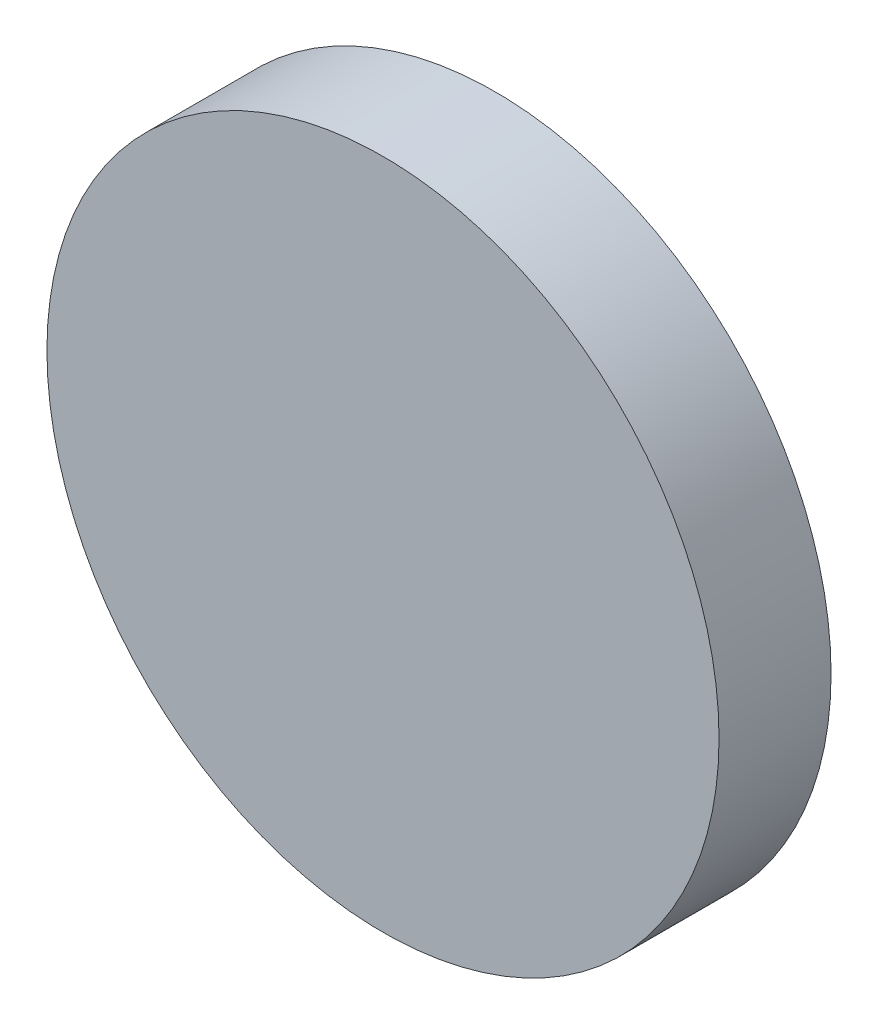
ISO-10303-21;
HEADER;
FILE_DESCRIPTION(('STEP AP214'),'2;1');
FILE_NAME('part.step','',(''),(''),'','','');
FILE_SCHEMA(('AUTOMOTIVE_DESIGN { 1 0 10303 214 1 1 1 1 }'));
ENDSEC;
DATA;
#1=APPLICATION_CONTEXT('core data for automotive mechanical design processes');
#2=APPLICATION_PROTOCOL_DEFINITION('international standard','automotive_design',2000,#1);
#3=PRODUCT_CONTEXT('',#1,'mechanical');
#4=PRODUCT('Part','Part','',(#3));
#5=PRODUCT_RELATED_PRODUCT_CATEGORY('part','',(#4));
#6=PRODUCT_DEFINITION_FORMATION('','',#4);
#7=PRODUCT_DEFINITION_CONTEXT('part definition',#1,'design');
#8=PRODUCT_DEFINITION('design','',#6,#7);
#9=PRODUCT_DEFINITION_SHAPE('','',#8);
#10=(LENGTH_UNIT() NAMED_UNIT(*) SI_UNIT(.MILLI.,.METRE.));
#11=(NAMED_UNIT(*) PLANE_ANGLE_UNIT() SI_UNIT($,.RADIAN.));
#12=(NAMED_UNIT(*) SI_UNIT($,.STERADIAN.) SOLID_ANGLE_UNIT());
#13=UNCERTAINTY_MEASURE_WITH_UNIT(LENGTH_MEASURE(1.E-05),#10,'distance_accuracy_value','');
#14=(GEOMETRIC_REPRESENTATION_CONTEXT(3) GLOBAL_UNCERTAINTY_ASSIGNED_CONTEXT((#13)) GLOBAL_UNIT_ASSIGNED_CONTEXT((#10,
#11,#12)) REPRESENTATION_CONTEXT('',''));
#15=CARTESIAN_POINT('',(0.,0.,0.));
#16=DIRECTION('',(0.,0.,1.));
#17=DIRECTION('',(1.,0.,0.));
#18=AXIS2_PLACEMENT_3D('',#15,#16,#17);
#19=CARTESIAN_POINT('',(0.,0.,-50.));
#20=DIRECTION('',(0.,0.,1.));
#21=DIRECTION('',(1.,0.,0.));
#22=AXIS2_PLACEMENT_3D('',#19,#20,#21);
#23=CYLINDRICAL_SURFACE('',#22,150.);
#24=CARTESIAN_POINT('',(0.,0.,-50.));
#25=DIRECTION('',(0.,0.,1.));
#26=DIRECTION('',(1.,0.,0.));
#27=AXIS2_PLACEMENT_3D('',#24,#25,#26);
#28=CIRCLE('',#27,150.);
#29=CARTESIAN_POINT('',(150.,0.,-50.));
#30=VERTEX_POINT('',#29);
#31=EDGE_CURVE('E10',#30,#30,#28,.T.);
#32=ORIENTED_EDGE('',*,*,#31,.T.);
#33=EDGE_LOOP('',(#32));
#34=FACE_BOUND('',#33,.T.);
#35=CARTESIAN_POINT('',(0.,0.,0.));
#36=DIRECTION('',(0.,0.,1.));
#37=DIRECTION('',(1.,0.,0.));
#38=AXIS2_PLACEMENT_3D('',#35,#36,#37);
#39=CIRCLE('',#38,150.);
#40=CARTESIAN_POINT('',(150.,0.,0.));
#41=VERTEX_POINT('',#40);
#42=EDGE_CURVE('E35',#41,#41,#39,.T.);
#43=ORIENTED_EDGE('',*,*,#42,.F.);
#44=EDGE_LOOP('',(#43));
#45=FACE_BOUND('',#44,.T.);
#46=ADVANCED_FACE('F32',(#34,#45),#23,.T.);
#47=CARTESIAN_POINT('',(0.,0.,-50.));
#48=DIRECTION('',(0.,0.,1.));
#49=DIRECTION('',(1.,0.,0.));
#50=AXIS2_PLACEMENT_3D('',#47,#48,#49);
#51=PLANE('',#50);
#52=ORIENTED_EDGE('',*,*,#31,.F.);
#53=EDGE_LOOP('',(#52));
#54=FACE_BOUND('',#53,.T.);
#55=ADVANCED_FACE('F47',(#54),#51,.F.);
#56=CARTESIAN_POINT('',(0.,0.,0.));
#57=DIRECTION('',(0.,0.,1.));
#58=DIRECTION('',(1.,0.,0.));
#59=AXIS2_PLACEMENT_3D('',#56,#57,#58);
#60=PLANE('',#59);
#61=ORIENTED_EDGE('',*,*,#42,.T.);
#62=EDGE_LOOP('',(#61));
#63=FACE_BOUND('',#62,.T.);
#64=ADVANCED_FACE('F44',(#63),#60,.T.);
#65=CLOSED_SHELL('',(#46,#55,#64));
#66=MANIFOLD_SOLID_BREP('B2',#65);
#67=ADVANCED_BREP_SHAPE_REPRESENTATION('',(#18,#66),#14);
#68=SHAPE_DEFINITION_REPRESENTATION(#9,#67);
ENDSEC;
END-ISO-10303-21;
